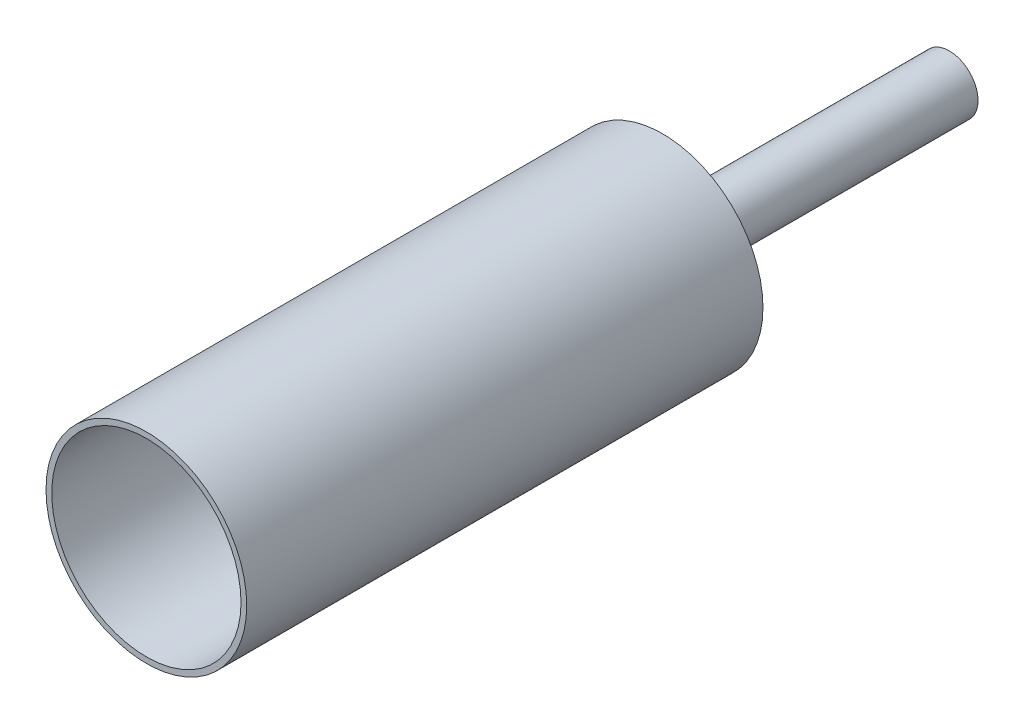
ISO-10303-21;
HEADER;
FILE_DESCRIPTION(('STEP AP214'),'2;1');
FILE_NAME('part.step','',(''),(''),'','','');
FILE_SCHEMA(('AUTOMOTIVE_DESIGN { 1 0 10303 214 1 1 1 1 }'));
ENDSEC;
DATA;
#1=APPLICATION_CONTEXT('core data for automotive mechanical design processes');
#2=APPLICATION_PROTOCOL_DEFINITION('international standard','automotive_design',2000,#1);
#3=PRODUCT_CONTEXT('',#1,'mechanical');
#4=PRODUCT('Part','Part','',(#3));
#5=PRODUCT_RELATED_PRODUCT_CATEGORY('part','',(#4));
#6=PRODUCT_DEFINITION_FORMATION('','',#4);
#7=PRODUCT_DEFINITION_CONTEXT('part definition',#1,'design');
#8=PRODUCT_DEFINITION('design','',#6,#7);
#9=PRODUCT_DEFINITION_SHAPE('','',#8);
#10=(LENGTH_UNIT() NAMED_UNIT(*) SI_UNIT(.MILLI.,.METRE.));
#11=(NAMED_UNIT(*) PLANE_ANGLE_UNIT() SI_UNIT($,.RADIAN.));
#12=(NAMED_UNIT(*) SI_UNIT($,.STERADIAN.) SOLID_ANGLE_UNIT());
#13=UNCERTAINTY_MEASURE_WITH_UNIT(LENGTH_MEASURE(1.E-05),#10,'distance_accuracy_value','');
#14=(GEOMETRIC_REPRESENTATION_CONTEXT(3) GLOBAL_UNCERTAINTY_ASSIGNED_CONTEXT((#13)) GLOBAL_UNIT_ASSIGNED_CONTEXT((#10,
#11,#12)) REPRESENTATION_CONTEXT('',''));
#15=CARTESIAN_POINT('',(0.,0.,0.));
#16=DIRECTION('',(0.,0.,1.));
#17=DIRECTION('',(1.,0.,0.));
#18=AXIS2_PLACEMENT_3D('',#15,#16,#17);
#19=CARTESIAN_POINT('',(0.,0.,90.));
#20=DIRECTION('',(0.,0.,-1.));
#21=DIRECTION('',(-1.,0.,0.));
#22=AXIS2_PLACEMENT_3D('',#19,#20,#21);
#23=CYLINDRICAL_SURFACE('',#22,17.5);
#24=CARTESIAN_POINT('',(0.,0.,90.));
#25=DIRECTION('',(0.,0.,1.));
#26=DIRECTION('',(1.,0.,0.));
#27=AXIS2_PLACEMENT_3D('',#24,#25,#26);
#28=CIRCLE('',#27,17.5);
#29=CARTESIAN_POINT('',(-17.5,0.,90.));
#30=VERTEX_POINT('',#29);
#31=EDGE_CURVE('E45',#30,#30,#28,.T.);
#32=CARTESIAN_POINT('',(0.,0.,0.));
#33=DIRECTION('',(0.,0.,1.));
#34=DIRECTION('',(1.,0.,0.));
#35=AXIS2_PLACEMENT_3D('',#32,#33,#34);
#36=CIRCLE('',#35,17.5);
#37=CARTESIAN_POINT('',(-17.5,0.,0.));
#38=VERTEX_POINT('',#37);
#39=EDGE_CURVE('E40',#38,#38,#36,.T.);
#40=CARTESIAN_POINT('',(-17.5,0.,90.));
#41=CARTESIAN_POINT('',(-17.5,0.,89.0625));
#42=CARTESIAN_POINT('',(-17.5,0.,88.125));
#43=CARTESIAN_POINT('',(-17.5,0.,86.25));
#44=CARTESIAN_POINT('',(-17.5,0.,85.3125));
#45=CARTESIAN_POINT('',(-17.5,0.,83.4375));
#46=CARTESIAN_POINT('',(-17.5,0.,82.5));
#47=CARTESIAN_POINT('',(-17.5,0.,80.625));
#48=CARTESIAN_POINT('',(-17.5,0.,79.6875));
#49=CARTESIAN_POINT('',(-17.5,0.,77.8125));
#50=CARTESIAN_POINT('',(-17.5,0.,76.875));
#51=CARTESIAN_POINT('',(-17.5,0.,75.));
#52=CARTESIAN_POINT('',(-17.5,0.,74.0625));
#53=CARTESIAN_POINT('',(-17.5,0.,72.1875));
#54=CARTESIAN_POINT('',(-17.5,0.,71.25));
#55=CARTESIAN_POINT('',(-17.5,0.,69.375));
#56=CARTESIAN_POINT('',(-17.5,0.,68.4375));
#57=CARTESIAN_POINT('',(-17.5,0.,66.5625));
#58=CARTESIAN_POINT('',(-17.5,0.,65.625));
#59=CARTESIAN_POINT('',(-17.5,0.,63.75));
#60=CARTESIAN_POINT('',(-17.5,0.,62.8125));
#61=CARTESIAN_POINT('',(-17.5,0.,60.9375));
#62=CARTESIAN_POINT('',(-17.5,0.,60.));
#63=CARTESIAN_POINT('',(-17.5,0.,58.125));
#64=CARTESIAN_POINT('',(-17.5,0.,57.1875));
#65=CARTESIAN_POINT('',(-17.5,0.,55.3125));
#66=CARTESIAN_POINT('',(-17.5,0.,54.375));
#67=CARTESIAN_POINT('',(-17.5,0.,52.5));
#68=CARTESIAN_POINT('',(-17.5,0.,51.5625));
#69=CARTESIAN_POINT('',(-17.5,0.,49.6875));
#70=CARTESIAN_POINT('',(-17.5,0.,48.75));
#71=CARTESIAN_POINT('',(-17.5,0.,46.875));
#72=CARTESIAN_POINT('',(-17.5,0.,45.9375));
#73=CARTESIAN_POINT('',(-17.5,0.,44.0625));
#74=CARTESIAN_POINT('',(-17.5,0.,43.125));
#75=CARTESIAN_POINT('',(-17.5,0.,41.25));
#76=CARTESIAN_POINT('',(-17.5,0.,40.3125));
#77=CARTESIAN_POINT('',(-17.5,0.,38.4375));
#78=CARTESIAN_POINT('',(-17.5,0.,37.5));
#79=CARTESIAN_POINT('',(-17.5,0.,35.625));
#80=CARTESIAN_POINT('',(-17.5,0.,34.6875));
#81=CARTESIAN_POINT('',(-17.5,0.,32.8125));
#82=CARTESIAN_POINT('',(-17.5,0.,31.875));
#83=CARTESIAN_POINT('',(-17.5,0.,30.));
#84=CARTESIAN_POINT('',(-17.5,0.,29.0625));
#85=CARTESIAN_POINT('',(-17.5,0.,27.1875));
#86=CARTESIAN_POINT('',(-17.5,0.,26.25));
#87=CARTESIAN_POINT('',(-17.5,0.,24.375));
#88=CARTESIAN_POINT('',(-17.5,0.,23.4375));
#89=CARTESIAN_POINT('',(-17.5,0.,21.5625));
#90=CARTESIAN_POINT('',(-17.5,0.,20.625));
#91=CARTESIAN_POINT('',(-17.5,0.,18.75));
#92=CARTESIAN_POINT('',(-17.5,0.,17.8125));
#93=CARTESIAN_POINT('',(-17.5,0.,15.9375));
#94=CARTESIAN_POINT('',(-17.5,0.,15.));
#95=CARTESIAN_POINT('',(-17.5,0.,13.125));
#96=CARTESIAN_POINT('',(-17.5,0.,12.1875));
#97=CARTESIAN_POINT('',(-17.5,0.,10.3125));
#98=CARTESIAN_POINT('',(-17.5,0.,9.37499999999999));
#99=CARTESIAN_POINT('',(-17.5,0.,7.49999999999999));
#100=CARTESIAN_POINT('',(-17.5,0.,6.56249999999999));
#101=CARTESIAN_POINT('',(-17.5,0.,4.68749999999999));
#102=CARTESIAN_POINT('',(-17.5,0.,3.74999999999998));
#103=CARTESIAN_POINT('',(-17.5,0.,1.87499999999998));
#104=CARTESIAN_POINT('',(-17.5,0.,0.937499999999986));
#105=CARTESIAN_POINT('',(-17.5,0.,0.));
#106=B_SPLINE_CURVE_WITH_KNOTS('',3,(#40,#41,#42,#43,#44,#45,#46,#47,#48,#49,#50,#51,#52,#53,
#54,#55,#56,#57,#58,#59,#60,#61,#62,#63,#64,#65,#66,#67,#68,#69,#70,#71,#72,#73,#74,#75,#76,#77,
#78,#79,#80,#81,#82,#83,#84,#85,#86,#87,#88,#89,#90,#91,#92,#93,#94,#95,#96,#97,#98,#99,#100,
#101,#102,#103,#104,#105),.UNSPECIFIED.,.F.,.F.,(4,2,2,2,2,2,2,2,2,2,2,2,2,2,2,2,2,2,2,2,2,2,2,
2,2,2,2,2,2,2,2,2,4),(0.,2.81250000000001,5.62500000000001,8.43750000000001,11.25,14.0625,
16.875,19.6875,22.5,25.3125,28.125,30.9375,33.75,36.5625,39.375,42.1875,45.,47.8125,50.625,
53.4375,56.25,59.0625,61.875,64.6875,67.5,70.3125,73.125,75.9375,78.75,81.5625,84.375,87.1875,
90.),.UNSPECIFIED.);
#107=EDGE_CURVE('BSEAM37',#30,#38,#106,.T.);
#108=ORIENTED_EDGE('',*,*,#31,.F.);
#109=ORIENTED_EDGE('',*,*,#39,.T.);
#110=ORIENTED_EDGE('',*,*,#107,.T.);
#111=ORIENTED_EDGE('',*,*,#107,.F.);
#112=EDGE_LOOP('',(#108,#110,#109,#111));
#113=FACE_BOUND('',#112,.T.);
#114=ADVANCED_FACE('F37',(#113),#23,.T.);
#115=CARTESIAN_POINT('',(0.,0.,90.));
#116=DIRECTION('',(0.,0.,1.));
#117=DIRECTION('',(1.,0.,0.));
#118=AXIS2_PLACEMENT_3D('',#115,#116,#117);
#119=PLANE('',#118);
#120=CARTESIAN_POINT('',(0.,0.,90.));
#121=DIRECTION('',(0.,0.,1.));
#122=DIRECTION('',(1.,0.,0.));
#123=AXIS2_PLACEMENT_3D('',#120,#121,#122);
#124=CIRCLE('',#123,16.5);
#125=CARTESIAN_POINT('',(16.5,0.,90.));
#126=VERTEX_POINT('',#125);
#127=EDGE_CURVE('E58',#126,#126,#124,.T.);
#128=ORIENTED_EDGE('',*,*,#127,.F.);
#129=EDGE_LOOP('',(#128));
#130=FACE_BOUND('',#129,.T.);
#131=ORIENTED_EDGE('',*,*,#31,.T.);
#132=EDGE_LOOP('',(#131));
#133=FACE_BOUND('',#132,.T.);
#134=ADVANCED_FACE('F82',(#130,#133),#119,.T.);
#135=CARTESIAN_POINT('',(0.,0.,0.));
#136=DIRECTION('',(0.,0.,1.));
#137=DIRECTION('',(1.,0.,0.));
#138=AXIS2_PLACEMENT_3D('',#135,#136,#137);
#139=PLANE('',#138);
#140=CARTESIAN_POINT('',(0.,0.,0.));
#141=DIRECTION('',(0.,0.,-1.));
#142=DIRECTION('',(-1.,0.,0.));
#143=AXIS2_PLACEMENT_3D('',#140,#141,#142);
#144=CIRCLE('',#143,5.);
#145=CARTESIAN_POINT('',(-5.,0.,0.));
#146=VERTEX_POINT('',#145);
#147=EDGE_CURVE('E10',#146,#146,#144,.T.);
#148=ORIENTED_EDGE('',*,*,#147,.F.);
#149=EDGE_LOOP('',(#148));
#150=FACE_BOUND('',#149,.T.);
#151=ORIENTED_EDGE('',*,*,#39,.F.);
#152=EDGE_LOOP('',(#151));
#153=FACE_BOUND('',#152,.T.);
#154=ADVANCED_FACE('F87',(#150,#153),#139,.F.);
#155=CARTESIAN_POINT('',(0.,0.,2.));
#156=DIRECTION('',(0.,0.,1.));
#157=DIRECTION('',(1.,0.,0.));
#158=AXIS2_PLACEMENT_3D('',#155,#156,#157);
#159=CYLINDRICAL_SURFACE('',#158,16.5);
#160=CARTESIAN_POINT('',(0.,0.,2.));
#161=DIRECTION('',(0.,0.,1.));
#162=DIRECTION('',(1.,0.,0.));
#163=AXIS2_PLACEMENT_3D('',#160,#161,#162);
#164=CIRCLE('',#163,16.5);
#165=CARTESIAN_POINT('',(16.5,0.,2.));
#166=VERTEX_POINT('',#165);
#167=EDGE_CURVE('E54',#166,#166,#164,.T.);
#168=ORIENTED_EDGE('',*,*,#167,.F.);
#169=EDGE_LOOP('',(#168));
#170=FACE_BOUND('',#169,.T.);
#171=ORIENTED_EDGE('',*,*,#127,.T.);
#172=EDGE_LOOP('',(#171));
#173=FACE_BOUND('',#172,.T.);
#174=ADVANCED_FACE('F78',(#170,#173),#159,.F.);
#175=CARTESIAN_POINT('',(0.,0.,2.));
#176=DIRECTION('',(0.,0.,1.));
#177=DIRECTION('',(1.,0.,0.));
#178=AXIS2_PLACEMENT_3D('',#175,#176,#177);
#179=PLANE('',#178);
#180=ORIENTED_EDGE('',*,*,#167,.T.);
#181=EDGE_LOOP('',(#180));
#182=FACE_BOUND('',#181,.T.);
#183=ADVANCED_FACE('F71',(#182),#179,.T.);
#184=CARTESIAN_POINT('',(0.,0.,-50.));
#185=DIRECTION('',(0.,0.,1.));
#186=DIRECTION('',(1.,0.,0.));
#187=AXIS2_PLACEMENT_3D('',#184,#185,#186);
#188=CYLINDRICAL_SURFACE('',#187,5.);
#189=CARTESIAN_POINT('',(0.,0.,-50.));
#190=DIRECTION('',(0.,0.,-1.));
#191=DIRECTION('',(-1.,0.,0.));
#192=AXIS2_PLACEMENT_3D('',#189,#190,#191);
#193=CIRCLE('',#192,5.);
#194=CARTESIAN_POINT('',(-5.,0.,-50.));
#195=VERTEX_POINT('',#194);
#196=EDGE_CURVE('E53',#195,#195,#193,.T.);
#197=ORIENTED_EDGE('',*,*,#196,.F.);
#198=EDGE_LOOP('',(#197));
#199=FACE_BOUND('',#198,.T.);
#200=ORIENTED_EDGE('',*,*,#147,.T.);
#201=EDGE_LOOP('',(#200));
#202=FACE_BOUND('',#201,.T.);
#203=ADVANCED_FACE('F69',(#199,#202),#188,.T.);
#204=CARTESIAN_POINT('',(0.,0.,-50.));
#205=DIRECTION('',(0.,0.,-1.));
#206=DIRECTION('',(-1.,0.,0.));
#207=AXIS2_PLACEMENT_3D('',#204,#205,#206);
#208=PLANE('',#207);
#209=ORIENTED_EDGE('',*,*,#196,.T.);
#210=EDGE_LOOP('',(#209));
#211=FACE_BOUND('',#210,.T.);
#212=ADVANCED_FACE('F67',(#211),#208,.T.);
#213=CLOSED_SHELL('',(#114,#134,#154,#174,#183,#203,#212));
#214=MANIFOLD_SOLID_BREP('B2',#213);
#215=ADVANCED_BREP_SHAPE_REPRESENTATION('',(#18,#214),#14);
#216=SHAPE_DEFINITION_REPRESENTATION(#9,#215);
ENDSEC;
END-ISO-10303-21;
